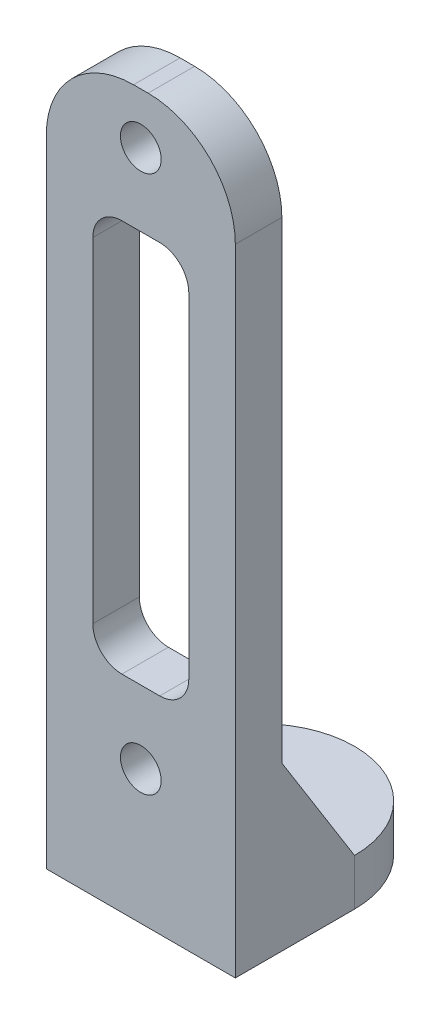
ISO-10303-21;
HEADER;
FILE_DESCRIPTION(('STEP AP214'),'2;1');
FILE_NAME('part.step','',(''),(''),'','','');
FILE_SCHEMA(('AUTOMOTIVE_DESIGN { 1 0 10303 214 1 1 1 1 }'));
ENDSEC;
DATA;
#1=APPLICATION_CONTEXT('core data for automotive mechanical design processes');
#2=APPLICATION_PROTOCOL_DEFINITION('international standard','automotive_design',2000,#1);
#3=PRODUCT_CONTEXT('',#1,'mechanical');
#4=PRODUCT('Part','Part','',(#3));
#5=PRODUCT_RELATED_PRODUCT_CATEGORY('part','',(#4));
#6=PRODUCT_DEFINITION_FORMATION('','',#4);
#7=PRODUCT_DEFINITION_CONTEXT('part definition',#1,'design');
#8=PRODUCT_DEFINITION('design','',#6,#7);
#9=PRODUCT_DEFINITION_SHAPE('','',#8);
#10=(LENGTH_UNIT() NAMED_UNIT(*) SI_UNIT(.MILLI.,.METRE.));
#11=(NAMED_UNIT(*) PLANE_ANGLE_UNIT() SI_UNIT($,.RADIAN.));
#12=(NAMED_UNIT(*) SI_UNIT($,.STERADIAN.) SOLID_ANGLE_UNIT());
#13=UNCERTAINTY_MEASURE_WITH_UNIT(LENGTH_MEASURE(1.E-05),#10,'distance_accuracy_value','');
#14=(GEOMETRIC_REPRESENTATION_CONTEXT(3) GLOBAL_UNCERTAINTY_ASSIGNED_CONTEXT((#13)) GLOBAL_UNIT_ASSIGNED_CONTEXT((#10,
#11,#12)) REPRESENTATION_CONTEXT('',''));
#15=CARTESIAN_POINT('',(0.,0.,0.));
#16=DIRECTION('',(0.,0.,1.));
#17=DIRECTION('',(1.,0.,0.));
#18=AXIS2_PLACEMENT_3D('',#15,#16,#17);
#19=CARTESIAN_POINT('',(6.,40.5,0.));
#20=DIRECTION('',(0.,0.,-1.));
#21=DIRECTION('',(-1.,0.,0.));
#22=AXIS2_PLACEMENT_3D('',#19,#20,#21);
#23=PLANE('',#22);
#24=CARTESIAN_POINT('',(6.5,6.,0.));
#25=DIRECTION('',(0.,0.,1.));
#26=DIRECTION('',(1.,0.,0.));
#27=AXIS2_PLACEMENT_3D('',#24,#25,#26);
#28=CIRCLE('',#27,1.4);
#29=CARTESIAN_POINT('',(7.9,6.,0.));
#30=VERTEX_POINT('',#29);
#31=EDGE_CURVE('E294',#30,#30,#28,.T.);
#32=ORIENTED_EDGE('',*,*,#31,.T.);
#33=EDGE_LOOP('',(#32));
#34=FACE_BOUND('',#33,.T.);
#35=CARTESIAN_POINT('',(6.5,43.,0.));
#36=DIRECTION('',(0.,0.,1.));
#37=DIRECTION('',(1.,0.,0.));
#38=AXIS2_PLACEMENT_3D('',#35,#36,#37);
#39=CIRCLE('',#38,1.4);
#40=CARTESIAN_POINT('',(7.9,43.,0.));
#41=VERTEX_POINT('',#40);
#42=EDGE_CURVE('E289',#41,#41,#39,.T.);
#43=ORIENTED_EDGE('',*,*,#42,.T.);
#44=EDGE_LOOP('',(#43));
#45=FACE_BOUND('',#44,.T.);
#46=DIRECTION('',(0.,1.,0.));
#47=VECTOR('',#46,1.);
#48=CARTESIAN_POINT('',(13.,0.,0.));
#49=LINE('',#48,#47);
#50=CARTESIAN_POINT('',(13.,8.,0.));
#51=VERTEX_POINT('',#50);
#52=CARTESIAN_POINT('',(13.,40.5,0.));
#53=VERTEX_POINT('',#52);
#54=EDGE_CURVE('E37',#51,#53,#49,.T.);
#55=ORIENTED_EDGE('',*,*,#54,.F.);
#56=DIRECTION('',(-1.,0.,0.));
#57=VECTOR('',#56,1.);
#58=CARTESIAN_POINT('',(13.,8.,0.));
#59=LINE('',#58,#57);
#60=CARTESIAN_POINT('',(11.,8.,0.));
#61=VERTEX_POINT('',#60);
#62=EDGE_CURVE('E236',#51,#61,#59,.T.);
#63=ORIENTED_EDGE('',*,*,#62,.T.);
#64=DIRECTION('',(0.,-1.,0.));
#65=VECTOR('',#64,1.);
#66=CARTESIAN_POINT('',(11.,8.,0.));
#67=LINE('',#66,#65);
#68=CARTESIAN_POINT('',(11.,0.,0.));
#69=VERTEX_POINT('',#68);
#70=EDGE_CURVE('E183',#61,#69,#67,.T.);
#71=ORIENTED_EDGE('',*,*,#70,.T.);
#72=DIRECTION('',(1.,0.,0.));
#73=VECTOR('',#72,1.);
#74=CARTESIAN_POINT('',(0.,0.,0.));
#75=LINE('',#74,#73);
#76=CARTESIAN_POINT('',(2.,0.,0.));
#77=VERTEX_POINT('',#76);
#78=EDGE_CURVE('E319',#77,#69,#75,.T.);
#79=ORIENTED_EDGE('',*,*,#78,.F.);
#80=DIRECTION('',(0.,-1.,0.));
#81=VECTOR('',#80,1.);
#82=CARTESIAN_POINT('',(2.,8.,0.));
#83=LINE('',#82,#81);
#84=CARTESIAN_POINT('',(2.,8.,0.));
#85=VERTEX_POINT('',#84);
#86=EDGE_CURVE('E248',#85,#77,#83,.T.);
#87=ORIENTED_EDGE('',*,*,#86,.F.);
#88=DIRECTION('',(-1.,0.,0.));
#89=VECTOR('',#88,1.);
#90=CARTESIAN_POINT('',(2.,8.,0.));
#91=LINE('',#90,#89);
#92=CARTESIAN_POINT('',(0.,8.,0.));
#93=VERTEX_POINT('',#92);
#94=EDGE_CURVE('E257',#85,#93,#91,.T.);
#95=ORIENTED_EDGE('',*,*,#94,.T.);
#96=DIRECTION('',(0.,-1.,0.));
#97=VECTOR('',#96,1.);
#98=CARTESIAN_POINT('',(0.,0.,0.));
#99=LINE('',#98,#97);
#100=CARTESIAN_POINT('',(0.,40.5,0.));
#101=VERTEX_POINT('',#100);
#102=EDGE_CURVE('E300',#101,#93,#99,.T.);
#103=ORIENTED_EDGE('',*,*,#102,.F.);
#104=CARTESIAN_POINT('',(6.,40.5,0.));
#105=DIRECTION('',(0.,0.,1.));
#106=DIRECTION('',(-1.,0.,0.));
#107=AXIS2_PLACEMENT_3D('',#104,#105,#106);
#108=CIRCLE('',#107,6.);
#109=CARTESIAN_POINT('',(6.,46.5,0.));
#110=VERTEX_POINT('',#109);
#111=EDGE_CURVE('E306',#110,#101,#108,.T.);
#112=ORIENTED_EDGE('',*,*,#111,.F.);
#113=DIRECTION('',(-1.,0.,0.));
#114=VECTOR('',#113,1.);
#115=CARTESIAN_POINT('',(6.,46.5,0.));
#116=LINE('',#115,#114);
#117=CARTESIAN_POINT('',(7.,46.5,0.));
#118=VERTEX_POINT('',#117);
#119=EDGE_CURVE('E334',#118,#110,#116,.T.);
#120=ORIENTED_EDGE('',*,*,#119,.F.);
#121=CARTESIAN_POINT('',(7.,40.5,0.));
#122=DIRECTION('',(0.,0.,1.));
#123=DIRECTION('',(-1.,0.,0.));
#124=AXIS2_PLACEMENT_3D('',#121,#122,#123);
#125=CIRCLE('',#124,6.);
#126=EDGE_CURVE('E317',#53,#118,#125,.T.);
#127=ORIENTED_EDGE('',*,*,#126,.F.);
#128=EDGE_LOOP('',(#55,#63,#71,#79,#87,#95,#103,#112,#120,#127));
#129=FACE_BOUND('',#128,.T.);
#130=DIRECTION('',(0.,-1.,0.));
#131=VECTOR('',#130,1.);
#132=CARTESIAN_POINT('',(3.2,36.,0.));
#133=LINE('',#132,#131);
#134=CARTESIAN_POINT('',(3.2,36.,0.));
#135=VERTEX_POINT('',#134);
#136=CARTESIAN_POINT('',(3.2,13.,0.));
#137=VERTEX_POINT('',#136);
#138=EDGE_CURVE('E176',#135,#137,#133,.T.);
#139=ORIENTED_EDGE('',*,*,#138,.T.);
#140=CARTESIAN_POINT('',(5.2,13.,0.));
#141=DIRECTION('',(0.,0.,1.));
#142=DIRECTION('',(1.,0.,0.));
#143=AXIS2_PLACEMENT_3D('',#140,#141,#142);
#144=CIRCLE('',#143,2.);
#145=CARTESIAN_POINT('',(5.2,11.,0.));
#146=VERTEX_POINT('',#145);
#147=EDGE_CURVE('E51',#137,#146,#144,.T.);
#148=ORIENTED_EDGE('',*,*,#147,.T.);
#149=DIRECTION('',(1.,0.,0.));
#150=VECTOR('',#149,1.);
#151=CARTESIAN_POINT('',(5.2,11.,0.));
#152=LINE('',#151,#150);
#153=CARTESIAN_POINT('',(7.8,11.,0.));
#154=VERTEX_POINT('',#153);
#155=EDGE_CURVE('E182',#146,#154,#152,.T.);
#156=ORIENTED_EDGE('',*,*,#155,.T.);
#157=CARTESIAN_POINT('',(7.8,13.,0.));
#158=DIRECTION('',(0.,0.,1.));
#159=DIRECTION('',(1.,0.,0.));
#160=AXIS2_PLACEMENT_3D('',#157,#158,#159);
#161=CIRCLE('',#160,2.);
#162=CARTESIAN_POINT('',(9.8,13.,0.));
#163=VERTEX_POINT('',#162);
#164=EDGE_CURVE('E205',#154,#163,#161,.T.);
#165=ORIENTED_EDGE('',*,*,#164,.T.);
#166=DIRECTION('',(0.,1.,0.));
#167=VECTOR('',#166,1.);
#168=CARTESIAN_POINT('',(9.8,36.,0.));
#169=LINE('',#168,#167);
#170=CARTESIAN_POINT('',(9.8,36.,0.));
#171=VERTEX_POINT('',#170);
#172=EDGE_CURVE('E208',#163,#171,#169,.T.);
#173=ORIENTED_EDGE('',*,*,#172,.T.);
#174=CARTESIAN_POINT('',(7.8,36.,0.));
#175=DIRECTION('',(0.,0.,1.));
#176=DIRECTION('',(-1.,0.,0.));
#177=AXIS2_PLACEMENT_3D('',#174,#175,#176);
#178=CIRCLE('',#177,2.);
#179=CARTESIAN_POINT('',(7.8,38.,0.));
#180=VERTEX_POINT('',#179);
#181=EDGE_CURVE('E211',#171,#180,#178,.T.);
#182=ORIENTED_EDGE('',*,*,#181,.T.);
#183=DIRECTION('',(-1.,0.,0.));
#184=VECTOR('',#183,1.);
#185=CARTESIAN_POINT('',(5.2,38.,0.));
#186=LINE('',#185,#184);
#187=CARTESIAN_POINT('',(5.2,38.,0.));
#188=VERTEX_POINT('',#187);
#189=EDGE_CURVE('E214',#180,#188,#186,.T.);
#190=ORIENTED_EDGE('',*,*,#189,.T.);
#191=CARTESIAN_POINT('',(5.2,36.,0.));
#192=DIRECTION('',(0.,0.,1.));
#193=DIRECTION('',(1.,0.,0.));
#194=AXIS2_PLACEMENT_3D('',#191,#192,#193);
#195=CIRCLE('',#194,2.);
#196=EDGE_CURVE('E217',#188,#135,#195,.T.);
#197=ORIENTED_EDGE('',*,*,#196,.T.);
#198=EDGE_LOOP('',(#139,#148,#156,#165,#173,#182,#190,#197));
#199=FACE_BOUND('',#198,.T.);
#200=ADVANCED_FACE('F33',(#34,#45,#129,#199),#23,.T.);
#201=CARTESIAN_POINT('',(6.,40.5,3.2));
#202=DIRECTION('',(0.,0.,-1.));
#203=DIRECTION('',(-1.,0.,0.));
#204=AXIS2_PLACEMENT_3D('',#201,#202,#203);
#205=PLANE('',#204);
#206=CARTESIAN_POINT('',(6.5,43.,3.2));
#207=DIRECTION('',(0.,0.,1.));
#208=DIRECTION('',(1.,0.,0.));
#209=AXIS2_PLACEMENT_3D('',#206,#207,#208);
#210=CIRCLE('',#209,1.4);
#211=CARTESIAN_POINT('',(7.9,43.,3.2));
#212=VERTEX_POINT('',#211);
#213=EDGE_CURVE('E291',#212,#212,#210,.T.);
#214=ORIENTED_EDGE('',*,*,#213,.F.);
#215=EDGE_LOOP('',(#214));
#216=FACE_BOUND('',#215,.T.);
#217=CARTESIAN_POINT('',(6.5,6.,3.2));
#218=DIRECTION('',(0.,0.,1.));
#219=DIRECTION('',(1.,0.,0.));
#220=AXIS2_PLACEMENT_3D('',#217,#218,#219);
#221=CIRCLE('',#220,1.4);
#222=CARTESIAN_POINT('',(7.9,6.,3.2));
#223=VERTEX_POINT('',#222);
#224=EDGE_CURVE('E297',#223,#223,#221,.T.);
#225=ORIENTED_EDGE('',*,*,#224,.F.);
#226=EDGE_LOOP('',(#225));
#227=FACE_BOUND('',#226,.T.);
#228=DIRECTION('',(0.,-1.,0.));
#229=VECTOR('',#228,1.);
#230=CARTESIAN_POINT('',(0.,0.,3.2));
#231=LINE('',#230,#229);
#232=CARTESIAN_POINT('',(0.,40.5,3.2));
#233=VERTEX_POINT('',#232);
#234=CARTESIAN_POINT('',(0.,-3.2,3.2));
#235=VERTEX_POINT('',#234);
#236=EDGE_CURVE('E303',#233,#235,#231,.T.);
#237=ORIENTED_EDGE('',*,*,#236,.T.);
#238=DIRECTION('',(1.,0.,0.));
#239=VECTOR('',#238,1.);
#240=CARTESIAN_POINT('',(0.,-3.2,3.2));
#241=LINE('',#240,#239);
#242=CARTESIAN_POINT('',(13.,-3.2,3.2));
#243=VERTEX_POINT('',#242);
#244=EDGE_CURVE('E277',#235,#243,#241,.T.);
#245=ORIENTED_EDGE('',*,*,#244,.T.);
#246=DIRECTION('',(0.,1.,0.));
#247=VECTOR('',#246,1.);
#248=CARTESIAN_POINT('',(13.,0.,3.2));
#249=LINE('',#248,#247);
#250=CARTESIAN_POINT('',(13.,40.5,3.2));
#251=VERTEX_POINT('',#250);
#252=EDGE_CURVE('E305',#243,#251,#249,.T.);
#253=ORIENTED_EDGE('',*,*,#252,.T.);
#254=CARTESIAN_POINT('',(7.,40.5,3.2));
#255=DIRECTION('',(0.,0.,1.));
#256=DIRECTION('',(-1.,0.,0.));
#257=AXIS2_PLACEMENT_3D('',#254,#255,#256);
#258=CIRCLE('',#257,6.);
#259=CARTESIAN_POINT('',(7.,46.5,3.2));
#260=VERTEX_POINT('',#259);
#261=EDGE_CURVE('E308',#251,#260,#258,.T.);
#262=ORIENTED_EDGE('',*,*,#261,.T.);
#263=DIRECTION('',(-1.,0.,0.));
#264=VECTOR('',#263,1.);
#265=CARTESIAN_POINT('',(6.,46.5,3.2));
#266=LINE('',#265,#264);
#267=CARTESIAN_POINT('',(6.,46.5,3.2));
#268=VERTEX_POINT('',#267);
#269=EDGE_CURVE('E310',#260,#268,#266,.T.);
#270=ORIENTED_EDGE('',*,*,#269,.T.);
#271=CARTESIAN_POINT('',(6.,40.5,3.2));
#272=DIRECTION('',(0.,0.,1.));
#273=DIRECTION('',(-1.,0.,0.));
#274=AXIS2_PLACEMENT_3D('',#271,#272,#273);
#275=CIRCLE('',#274,6.);
#276=EDGE_CURVE('E312',#268,#233,#275,.T.);
#277=ORIENTED_EDGE('',*,*,#276,.T.);
#278=EDGE_LOOP('',(#237,#245,#253,#262,#270,#277));
#279=FACE_BOUND('',#278,.T.);
#280=CARTESIAN_POINT('',(5.2,13.,3.2));
#281=DIRECTION('',(0.,0.,1.));
#282=DIRECTION('',(1.,0.,0.));
#283=AXIS2_PLACEMENT_3D('',#280,#281,#282);
#284=CIRCLE('',#283,2.);
#285=CARTESIAN_POINT('',(3.2,13.,3.2));
#286=VERTEX_POINT('',#285);
#287=CARTESIAN_POINT('',(5.2,11.,3.2));
#288=VERTEX_POINT('',#287);
#289=EDGE_CURVE('E167',#286,#288,#284,.T.);
#290=ORIENTED_EDGE('',*,*,#289,.F.);
#291=DIRECTION('',(0.,-1.,0.));
#292=VECTOR('',#291,1.);
#293=CARTESIAN_POINT('',(3.2,36.,3.2));
#294=LINE('',#293,#292);
#295=CARTESIAN_POINT('',(3.2,36.,3.2));
#296=VERTEX_POINT('',#295);
#297=EDGE_CURVE('E201',#296,#286,#294,.T.);
#298=ORIENTED_EDGE('',*,*,#297,.F.);
#299=CARTESIAN_POINT('',(5.2,36.,3.2));
#300=DIRECTION('',(0.,0.,1.));
#301=DIRECTION('',(1.,0.,0.));
#302=AXIS2_PLACEMENT_3D('',#299,#300,#301);
#303=CIRCLE('',#302,2.);
#304=CARTESIAN_POINT('',(5.2,38.,3.2));
#305=VERTEX_POINT('',#304);
#306=EDGE_CURVE('E199',#305,#296,#303,.T.);
#307=ORIENTED_EDGE('',*,*,#306,.F.);
#308=DIRECTION('',(-1.,0.,0.));
#309=VECTOR('',#308,1.);
#310=CARTESIAN_POINT('',(5.2,38.,3.2));
#311=LINE('',#310,#309);
#312=CARTESIAN_POINT('',(7.8,38.,3.2));
#313=VERTEX_POINT('',#312);
#314=EDGE_CURVE('E197',#313,#305,#311,.T.);
#315=ORIENTED_EDGE('',*,*,#314,.F.);
#316=CARTESIAN_POINT('',(7.8,36.,3.2));
#317=DIRECTION('',(0.,0.,1.));
#318=DIRECTION('',(-1.,0.,0.));
#319=AXIS2_PLACEMENT_3D('',#316,#317,#318);
#320=CIRCLE('',#319,2.);
#321=CARTESIAN_POINT('',(9.8,36.,3.2));
#322=VERTEX_POINT('',#321);
#323=EDGE_CURVE('E195',#322,#313,#320,.T.);
#324=ORIENTED_EDGE('',*,*,#323,.F.);
#325=DIRECTION('',(0.,1.,0.));
#326=VECTOR('',#325,1.);
#327=CARTESIAN_POINT('',(9.8,36.,3.2));
#328=LINE('',#327,#326);
#329=CARTESIAN_POINT('',(9.8,13.,3.2));
#330=VERTEX_POINT('',#329);
#331=EDGE_CURVE('E191',#330,#322,#328,.T.);
#332=ORIENTED_EDGE('',*,*,#331,.F.);
#333=CARTESIAN_POINT('',(7.8,13.,3.2));
#334=DIRECTION('',(0.,0.,1.));
#335=DIRECTION('',(1.,0.,0.));
#336=AXIS2_PLACEMENT_3D('',#333,#334,#335);
#337=CIRCLE('',#336,2.);
#338=CARTESIAN_POINT('',(7.8,11.,3.2));
#339=VERTEX_POINT('',#338);
#340=EDGE_CURVE('E189',#339,#330,#337,.T.);
#341=ORIENTED_EDGE('',*,*,#340,.F.);
#342=DIRECTION('',(1.,0.,0.));
#343=VECTOR('',#342,1.);
#344=CARTESIAN_POINT('',(5.2,11.,3.2));
#345=LINE('',#344,#343);
#346=EDGE_CURVE('E175',#288,#339,#345,.T.);
#347=ORIENTED_EDGE('',*,*,#346,.F.);
#348=EDGE_LOOP('',(#290,#298,#307,#315,#324,#332,#341,#347));
#349=FACE_BOUND('',#348,.T.);
#350=ADVANCED_FACE('F187',(#216,#227,#279,#349),#205,.F.);
#351=CARTESIAN_POINT('',(6.5,0.,-5.));
#352=DIRECTION('',(0.,1.,0.));
#353=DIRECTION('',(0.,0.,1.));
#354=AXIS2_PLACEMENT_3D('',#351,#352,#353);
#355=PLANE('',#354);
#356=CARTESIAN_POINT('',(6.5,0.,-5.));
#357=DIRECTION('',(0.,1.,0.));
#358=DIRECTION('',(0.,0.,1.));
#359=AXIS2_PLACEMENT_3D('',#356,#357,#358);
#360=CIRCLE('',#359,1.65);
#361=CARTESIAN_POINT('',(6.5,0.,-3.35));
#362=VERTEX_POINT('',#361);
#363=EDGE_CURVE('E264',#362,#362,#360,.T.);
#364=ORIENTED_EDGE('',*,*,#363,.F.);
#365=EDGE_LOOP('',(#364));
#366=FACE_BOUND('',#365,.T.);
#367=DIRECTION('',(0.,0.,-1.));
#368=VECTOR('',#367,1.);
#369=CARTESIAN_POINT('',(11.,0.,0.));
#370=LINE('',#369,#368);
#371=CARTESIAN_POINT('',(11.,0.,-5.));
#372=VERTEX_POINT('',#371);
#373=EDGE_CURVE('E239',#69,#372,#370,.T.);
#374=ORIENTED_EDGE('',*,*,#373,.T.);
#375=DIRECTION('',(-1.,0.,0.));
#376=VECTOR('',#375,1.);
#377=CARTESIAN_POINT('',(13.,0.,-5.));
#378=LINE('',#377,#376);
#379=CARTESIAN_POINT('',(13.,0.,-5.));
#380=VERTEX_POINT('',#379);
#381=EDGE_CURVE('E244',#380,#372,#378,.T.);
#382=ORIENTED_EDGE('',*,*,#381,.F.);
#383=CARTESIAN_POINT('',(6.5,0.,-5.));
#384=DIRECTION('',(0.,1.,0.));
#385=DIRECTION('',(0.,0.,1.));
#386=AXIS2_PLACEMENT_3D('',#383,#384,#385);
#387=CIRCLE('',#386,6.5);
#388=CARTESIAN_POINT('',(0.,0.,-5.));
#389=VERTEX_POINT('',#388);
#390=EDGE_CURVE('E268',#380,#389,#387,.T.);
#391=ORIENTED_EDGE('',*,*,#390,.T.);
#392=DIRECTION('',(-1.,0.,0.));
#393=VECTOR('',#392,1.);
#394=CARTESIAN_POINT('',(2.,0.,-5.));
#395=LINE('',#394,#393);
#396=CARTESIAN_POINT('',(2.,0.,-5.));
#397=VERTEX_POINT('',#396);
#398=EDGE_CURVE('E261',#397,#389,#395,.T.);
#399=ORIENTED_EDGE('',*,*,#398,.F.);
#400=DIRECTION('',(0.,0.,-1.));
#401=VECTOR('',#400,1.);
#402=CARTESIAN_POINT('',(2.,0.,0.));
#403=LINE('',#402,#401);
#404=EDGE_CURVE('E251',#77,#397,#403,.T.);
#405=ORIENTED_EDGE('',*,*,#404,.F.);
#406=ORIENTED_EDGE('',*,*,#78,.T.);
#407=EDGE_LOOP('',(#374,#382,#391,#399,#405,#406));
#408=FACE_BOUND('',#407,.T.);
#409=ADVANCED_FACE('F384',(#366,#408),#355,.T.);
#410=CARTESIAN_POINT('',(0.,0.,3.2));
#411=DIRECTION('',(1.,0.,0.));
#412=DIRECTION('',(0.,0.,-1.));
#413=AXIS2_PLACEMENT_3D('',#410,#411,#412);
#414=PLANE('',#413);
#415=ORIENTED_EDGE('',*,*,#102,.T.);
#416=DIRECTION('',(0.,0.847998304005088,0.52999894000318));
#417=VECTOR('',#416,1.);
#418=CARTESIAN_POINT('',(0.,0.,-5.));
#419=LINE('',#418,#417);
#420=EDGE_CURVE('E247',#389,#93,#419,.T.);
#421=ORIENTED_EDGE('',*,*,#420,.F.);
#422=DIRECTION('',(0.,1.,0.));
#423=VECTOR('',#422,1.);
#424=CARTESIAN_POINT('',(0.,-3.2,-5.));
#425=LINE('',#424,#423);
#426=CARTESIAN_POINT('',(0.,-3.2,-5.));
#427=VERTEX_POINT('',#426);
#428=EDGE_CURVE('E283',#427,#389,#425,.T.);
#429=ORIENTED_EDGE('',*,*,#428,.F.);
#430=DIRECTION('',(0.,0.,1.));
#431=VECTOR('',#430,1.);
#432=CARTESIAN_POINT('',(0.,-3.2,-5.));
#433=LINE('',#432,#431);
#434=EDGE_CURVE('E274',#427,#235,#433,.T.);
#435=ORIENTED_EDGE('',*,*,#434,.T.);
#436=ORIENTED_EDGE('',*,*,#236,.F.);
#437=DIRECTION('',(0.,0.,-1.));
#438=VECTOR('',#437,1.);
#439=CARTESIAN_POINT('',(0.,40.5,3.2));
#440=LINE('',#439,#438);
#441=EDGE_CURVE('E314',#233,#101,#440,.T.);
#442=ORIENTED_EDGE('',*,*,#441,.T.);
#443=EDGE_LOOP('',(#415,#421,#429,#435,#436,#442));
#444=FACE_BOUND('',#443,.T.);
#445=ADVANCED_FACE('F35',(#444),#414,.F.);
#446=CARTESIAN_POINT('',(13.,0.,3.2));
#447=DIRECTION('',(-1.,0.,0.));
#448=DIRECTION('',(0.,0.,1.));
#449=AXIS2_PLACEMENT_3D('',#446,#447,#448);
#450=PLANE('',#449);
#451=DIRECTION('',(0.,0.847998304005088,0.52999894000318));
#452=VECTOR('',#451,1.);
#453=CARTESIAN_POINT('',(13.,0.,-5.));
#454=LINE('',#453,#452);
#455=EDGE_CURVE('E233',#380,#51,#454,.T.);
#456=ORIENTED_EDGE('',*,*,#455,.T.);
#457=ORIENTED_EDGE('',*,*,#54,.T.);
#458=DIRECTION('',(0.,0.,-1.));
#459=VECTOR('',#458,1.);
#460=CARTESIAN_POINT('',(13.,40.5,3.2));
#461=LINE('',#460,#459);
#462=EDGE_CURVE('E11',#251,#53,#461,.T.);
#463=ORIENTED_EDGE('',*,*,#462,.F.);
#464=ORIENTED_EDGE('',*,*,#252,.F.);
#465=DIRECTION('',(0.,0.,-1.));
#466=VECTOR('',#465,1.);
#467=CARTESIAN_POINT('',(13.,-3.2,3.2));
#468=LINE('',#467,#466);
#469=CARTESIAN_POINT('',(13.,-3.2,-5.));
#470=VERTEX_POINT('',#469);
#471=EDGE_CURVE('E280',#243,#470,#468,.T.);
#472=ORIENTED_EDGE('',*,*,#471,.T.);
#473=DIRECTION('',(0.,1.,0.));
#474=VECTOR('',#473,1.);
#475=CARTESIAN_POINT('',(13.,-3.2,-5.));
#476=LINE('',#475,#474);
#477=EDGE_CURVE('E286',#470,#380,#476,.T.);
#478=ORIENTED_EDGE('',*,*,#477,.T.);
#479=EDGE_LOOP('',(#456,#457,#463,#464,#472,#478));
#480=FACE_BOUND('',#479,.T.);
#481=ADVANCED_FACE('F343',(#480),#450,.F.);
#482=CARTESIAN_POINT('',(7.,40.5,3.2));
#483=DIRECTION('',(0.,0.,-1.));
#484=DIRECTION('',(-1.,0.,0.));
#485=AXIS2_PLACEMENT_3D('',#482,#483,#484);
#486=CYLINDRICAL_SURFACE('',#485,6.);
#487=ORIENTED_EDGE('',*,*,#126,.T.);
#488=DIRECTION('',(0.,0.,-1.));
#489=VECTOR('',#488,1.);
#490=CARTESIAN_POINT('',(7.,46.5,3.2));
#491=LINE('',#490,#489);
#492=EDGE_CURVE('E43',#260,#118,#491,.T.);
#493=ORIENTED_EDGE('',*,*,#492,.F.);
#494=ORIENTED_EDGE('',*,*,#261,.F.);
#495=ORIENTED_EDGE('',*,*,#462,.T.);
#496=EDGE_LOOP('',(#487,#493,#494,#495));
#497=FACE_BOUND('',#496,.T.);
#498=ADVANCED_FACE('F348',(#497),#486,.T.);
#499=CARTESIAN_POINT('',(6.,46.5,3.2));
#500=DIRECTION('',(0.,-1.,0.));
#501=DIRECTION('',(0.,0.,-1.));
#502=AXIS2_PLACEMENT_3D('',#499,#500,#501);
#503=PLANE('',#502);
#504=ORIENTED_EDGE('',*,*,#119,.T.);
#505=DIRECTION('',(0.,0.,-1.));
#506=VECTOR('',#505,1.);
#507=CARTESIAN_POINT('',(6.,46.5,3.2));
#508=LINE('',#507,#506);
#509=EDGE_CURVE('E329',#268,#110,#508,.T.);
#510=ORIENTED_EDGE('',*,*,#509,.F.);
#511=ORIENTED_EDGE('',*,*,#269,.F.);
#512=ORIENTED_EDGE('',*,*,#492,.T.);
#513=EDGE_LOOP('',(#504,#510,#511,#512));
#514=FACE_BOUND('',#513,.T.);
#515=ADVANCED_FACE('F368',(#514),#503,.F.);
#516=CARTESIAN_POINT('',(6.,40.5,3.2));
#517=DIRECTION('',(0.,0.,-1.));
#518=DIRECTION('',(-1.,0.,0.));
#519=AXIS2_PLACEMENT_3D('',#516,#517,#518);
#520=CYLINDRICAL_SURFACE('',#519,6.);
#521=ORIENTED_EDGE('',*,*,#111,.T.);
#522=ORIENTED_EDGE('',*,*,#441,.F.);
#523=ORIENTED_EDGE('',*,*,#276,.F.);
#524=ORIENTED_EDGE('',*,*,#509,.T.);
#525=EDGE_LOOP('',(#521,#522,#523,#524));
#526=FACE_BOUND('',#525,.T.);
#527=ADVANCED_FACE('F354',(#526),#520,.T.);
#528=CARTESIAN_POINT('',(6.5,6.,3.2));
#529=DIRECTION('',(0.,0.,-1.));
#530=DIRECTION('',(-1.,0.,0.));
#531=AXIS2_PLACEMENT_3D('',#528,#529,#530);
#532=CYLINDRICAL_SURFACE('',#531,1.4);
#533=ORIENTED_EDGE('',*,*,#224,.T.);
#534=EDGE_LOOP('',(#533));
#535=FACE_BOUND('',#534,.T.);
#536=ORIENTED_EDGE('',*,*,#31,.F.);
#537=EDGE_LOOP('',(#536));
#538=FACE_BOUND('',#537,.T.);
#539=ADVANCED_FACE('F375',(#535,#538),#532,.F.);
#540=CARTESIAN_POINT('',(6.5,43.,3.2));
#541=DIRECTION('',(0.,0.,-1.));
#542=DIRECTION('',(-1.,0.,0.));
#543=AXIS2_PLACEMENT_3D('',#540,#541,#542);
#544=CYLINDRICAL_SURFACE('',#543,1.4);
#545=ORIENTED_EDGE('',*,*,#213,.T.);
#546=EDGE_LOOP('',(#545));
#547=FACE_BOUND('',#546,.T.);
#548=ORIENTED_EDGE('',*,*,#42,.F.);
#549=EDGE_LOOP('',(#548));
#550=FACE_BOUND('',#549,.T.);
#551=ADVANCED_FACE('F391',(#547,#550),#544,.F.);
#552=CARTESIAN_POINT('',(6.5,-3.2,-5.));
#553=DIRECTION('',(0.,1.,0.));
#554=DIRECTION('',(0.,0.,1.));
#555=AXIS2_PLACEMENT_3D('',#552,#553,#554);
#556=CYLINDRICAL_SURFACE('',#555,6.5);
#557=ORIENTED_EDGE('',*,*,#390,.F.);
#558=ORIENTED_EDGE('',*,*,#477,.F.);
#559=CARTESIAN_POINT('',(6.5,-3.2,-5.));
#560=DIRECTION('',(0.,1.,0.));
#561=DIRECTION('',(0.,0.,1.));
#562=AXIS2_PLACEMENT_3D('',#559,#560,#561);
#563=CIRCLE('',#562,6.5);
#564=EDGE_CURVE('E271',#470,#427,#563,.T.);
#565=ORIENTED_EDGE('',*,*,#564,.T.);
#566=ORIENTED_EDGE('',*,*,#428,.T.);
#567=EDGE_LOOP('',(#557,#558,#565,#566));
#568=FACE_BOUND('',#567,.T.);
#569=ADVANCED_FACE('F395',(#568),#556,.T.);
#570=CARTESIAN_POINT('',(6.5,-3.2,-5.));
#571=DIRECTION('',(0.,1.,0.));
#572=DIRECTION('',(0.,0.,1.));
#573=AXIS2_PLACEMENT_3D('',#570,#571,#572);
#574=PLANE('',#573);
#575=CARTESIAN_POINT('',(6.5,-3.2,-5.));
#576=DIRECTION('',(0.,1.,0.));
#577=DIRECTION('',(0.,0.,1.));
#578=AXIS2_PLACEMENT_3D('',#575,#576,#577);
#579=CIRCLE('',#578,1.65);
#580=CARTESIAN_POINT('',(6.5,-3.2,-3.35));
#581=VERTEX_POINT('',#580);
#582=EDGE_CURVE('E265',#581,#581,#579,.T.);
#583=ORIENTED_EDGE('',*,*,#582,.T.);
#584=EDGE_LOOP('',(#583));
#585=FACE_BOUND('',#584,.T.);
#586=ORIENTED_EDGE('',*,*,#564,.F.);
#587=ORIENTED_EDGE('',*,*,#471,.F.);
#588=ORIENTED_EDGE('',*,*,#244,.F.);
#589=ORIENTED_EDGE('',*,*,#434,.F.);
#590=EDGE_LOOP('',(#586,#587,#588,#589));
#591=FACE_BOUND('',#590,.T.);
#592=ADVANCED_FACE('F365',(#585,#591),#574,.F.);
#593=CARTESIAN_POINT('',(6.5,-3.2,-5.));
#594=DIRECTION('',(0.,1.,0.));
#595=DIRECTION('',(0.,0.,1.));
#596=AXIS2_PLACEMENT_3D('',#593,#594,#595);
#597=CYLINDRICAL_SURFACE('',#596,1.65);
#598=ORIENTED_EDGE('',*,*,#582,.F.);
#599=EDGE_LOOP('',(#598));
#600=FACE_BOUND('',#599,.T.);
#601=ORIENTED_EDGE('',*,*,#363,.T.);
#602=EDGE_LOOP('',(#601));
#603=FACE_BOUND('',#602,.T.);
#604=ADVANCED_FACE('F405',(#600,#603),#597,.F.);
#605=CARTESIAN_POINT('',(2.,0.,-5.));
#606=DIRECTION('',(0.,-0.52999894000318,0.847998304005088));
#607=DIRECTION('',(0.,-0.847998304005088,-0.52999894000318));
#608=AXIS2_PLACEMENT_3D('',#605,#606,#607);
#609=PLANE('',#608);
#610=ORIENTED_EDGE('',*,*,#420,.T.);
#611=ORIENTED_EDGE('',*,*,#94,.F.);
#612=DIRECTION('',(0.,0.847998304005088,0.52999894000318));
#613=VECTOR('',#612,1.);
#614=CARTESIAN_POINT('',(2.,0.,-5.));
#615=LINE('',#614,#613);
#616=EDGE_CURVE('E254',#397,#85,#615,.T.);
#617=ORIENTED_EDGE('',*,*,#616,.F.);
#618=ORIENTED_EDGE('',*,*,#398,.T.);
#619=EDGE_LOOP('',(#610,#611,#617,#618));
#620=FACE_BOUND('',#619,.T.);
#621=ADVANCED_FACE('F409',(#620),#609,.F.);
#622=CARTESIAN_POINT('',(2.,0.,0.));
#623=DIRECTION('',(1.,0.,0.));
#624=DIRECTION('',(0.,0.,-1.));
#625=AXIS2_PLACEMENT_3D('',#622,#623,#624);
#626=PLANE('',#625);
#627=ORIENTED_EDGE('',*,*,#86,.T.);
#628=ORIENTED_EDGE('',*,*,#404,.T.);
#629=ORIENTED_EDGE('',*,*,#616,.T.);
#630=EDGE_LOOP('',(#627,#628,#629));
#631=FACE_BOUND('',#630,.T.);
#632=ADVANCED_FACE('F413',(#631),#626,.T.);
#633=CARTESIAN_POINT('',(13.,0.,-5.));
#634=DIRECTION('',(0.,-0.52999894000318,0.847998304005088));
#635=DIRECTION('',(0.,-0.847998304005088,-0.52999894000318));
#636=AXIS2_PLACEMENT_3D('',#633,#634,#635);
#637=PLANE('',#636);
#638=DIRECTION('',(0.,0.847998304005088,0.52999894000318));
#639=VECTOR('',#638,1.);
#640=CARTESIAN_POINT('',(11.,0.,-5.));
#641=LINE('',#640,#639);
#642=EDGE_CURVE('E237',#372,#61,#641,.T.);
#643=ORIENTED_EDGE('',*,*,#642,.T.);
#644=ORIENTED_EDGE('',*,*,#62,.F.);
#645=ORIENTED_EDGE('',*,*,#455,.F.);
#646=ORIENTED_EDGE('',*,*,#381,.T.);
#647=EDGE_LOOP('',(#643,#644,#645,#646));
#648=FACE_BOUND('',#647,.T.);
#649=ADVANCED_FACE('F417',(#648),#637,.F.);
#650=CARTESIAN_POINT('',(11.,0.,0.));
#651=DIRECTION('',(1.,0.,0.));
#652=DIRECTION('',(0.,0.,-1.));
#653=AXIS2_PLACEMENT_3D('',#650,#651,#652);
#654=PLANE('',#653);
#655=ORIENTED_EDGE('',*,*,#70,.F.);
#656=ORIENTED_EDGE('',*,*,#642,.F.);
#657=ORIENTED_EDGE('',*,*,#373,.F.);
#658=EDGE_LOOP('',(#655,#656,#657));
#659=FACE_BOUND('',#658,.T.);
#660=ADVANCED_FACE('F421',(#659),#654,.F.);
#661=CARTESIAN_POINT('',(5.2,13.,3.2));
#662=DIRECTION('',(0.,0.,-1.));
#663=DIRECTION('',(-1.,0.,0.));
#664=AXIS2_PLACEMENT_3D('',#661,#662,#663);
#665=CYLINDRICAL_SURFACE('',#664,2.);
#666=ORIENTED_EDGE('',*,*,#147,.F.);
#667=DIRECTION('',(0.,0.,-1.));
#668=VECTOR('',#667,1.);
#669=CARTESIAN_POINT('',(3.2,13.,3.2));
#670=LINE('',#669,#668);
#671=EDGE_CURVE('E171',#286,#137,#670,.T.);
#672=ORIENTED_EDGE('',*,*,#671,.F.);
#673=ORIENTED_EDGE('',*,*,#289,.T.);
#674=DIRECTION('',(0.,0.,-1.));
#675=VECTOR('',#674,1.);
#676=CARTESIAN_POINT('',(5.2,11.,3.2));
#677=LINE('',#676,#675);
#678=EDGE_CURVE('E170',#288,#146,#677,.T.);
#679=ORIENTED_EDGE('',*,*,#678,.T.);
#680=EDGE_LOOP('',(#666,#672,#673,#679));
#681=FACE_BOUND('',#680,.T.);
#682=ADVANCED_FACE('F169',(#681),#665,.F.);
#683=CARTESIAN_POINT('',(5.2,11.,3.2));
#684=DIRECTION('',(0.,1.,0.));
#685=DIRECTION('',(0.,0.,1.));
#686=AXIS2_PLACEMENT_3D('',#683,#684,#685);
#687=PLANE('',#686);
#688=ORIENTED_EDGE('',*,*,#155,.F.);
#689=ORIENTED_EDGE('',*,*,#678,.F.);
#690=ORIENTED_EDGE('',*,*,#346,.T.);
#691=DIRECTION('',(0.,0.,-1.));
#692=VECTOR('',#691,1.);
#693=CARTESIAN_POINT('',(7.8,11.,3.2));
#694=LINE('',#693,#692);
#695=EDGE_CURVE('E184',#339,#154,#694,.T.);
#696=ORIENTED_EDGE('',*,*,#695,.T.);
#697=EDGE_LOOP('',(#688,#689,#690,#696));
#698=FACE_BOUND('',#697,.T.);
#699=ADVANCED_FACE('F179',(#698),#687,.T.);
#700=CARTESIAN_POINT('',(7.8,13.,3.2));
#701=DIRECTION('',(0.,0.,-1.));
#702=DIRECTION('',(-1.,0.,0.));
#703=AXIS2_PLACEMENT_3D('',#700,#701,#702);
#704=CYLINDRICAL_SURFACE('',#703,2.);
#705=ORIENTED_EDGE('',*,*,#164,.F.);
#706=ORIENTED_EDGE('',*,*,#695,.F.);
#707=ORIENTED_EDGE('',*,*,#340,.T.);
#708=DIRECTION('',(0.,0.,-1.));
#709=VECTOR('',#708,1.);
#710=CARTESIAN_POINT('',(9.8,13.,3.2));
#711=LINE('',#710,#709);
#712=EDGE_CURVE('E230',#330,#163,#711,.T.);
#713=ORIENTED_EDGE('',*,*,#712,.T.);
#714=EDGE_LOOP('',(#705,#706,#707,#713));
#715=FACE_BOUND('',#714,.T.);
#716=ADVANCED_FACE('F430',(#715),#704,.F.);
#717=CARTESIAN_POINT('',(9.8,36.,3.2));
#718=DIRECTION('',(-1.,0.,0.));
#719=DIRECTION('',(0.,-1.,0.));
#720=AXIS2_PLACEMENT_3D('',#717,#718,#719);
#721=PLANE('',#720);
#722=ORIENTED_EDGE('',*,*,#172,.F.);
#723=ORIENTED_EDGE('',*,*,#712,.F.);
#724=ORIENTED_EDGE('',*,*,#331,.T.);
#725=DIRECTION('',(0.,0.,-1.));
#726=VECTOR('',#725,1.);
#727=CARTESIAN_POINT('',(9.8,36.,3.2));
#728=LINE('',#727,#726);
#729=EDGE_CURVE('E228',#322,#171,#728,.T.);
#730=ORIENTED_EDGE('',*,*,#729,.T.);
#731=EDGE_LOOP('',(#722,#723,#724,#730));
#732=FACE_BOUND('',#731,.T.);
#733=ADVANCED_FACE('F433',(#732),#721,.T.);
#734=CARTESIAN_POINT('',(7.8,36.,3.2));
#735=DIRECTION('',(0.,0.,-1.));
#736=DIRECTION('',(-1.,0.,0.));
#737=AXIS2_PLACEMENT_3D('',#734,#735,#736);
#738=CYLINDRICAL_SURFACE('',#737,2.);
#739=ORIENTED_EDGE('',*,*,#181,.F.);
#740=ORIENTED_EDGE('',*,*,#729,.F.);
#741=ORIENTED_EDGE('',*,*,#323,.T.);
#742=DIRECTION('',(0.,0.,-1.));
#743=VECTOR('',#742,1.);
#744=CARTESIAN_POINT('',(7.8,38.,3.2));
#745=LINE('',#744,#743);
#746=EDGE_CURVE('E226',#313,#180,#745,.T.);
#747=ORIENTED_EDGE('',*,*,#746,.T.);
#748=EDGE_LOOP('',(#739,#740,#741,#747));
#749=FACE_BOUND('',#748,.T.);
#750=ADVANCED_FACE('F437',(#749),#738,.F.);
#751=CARTESIAN_POINT('',(5.2,38.,3.2));
#752=DIRECTION('',(0.,-1.,0.));
#753=DIRECTION('',(0.,0.,-1.));
#754=AXIS2_PLACEMENT_3D('',#751,#752,#753);
#755=PLANE('',#754);
#756=ORIENTED_EDGE('',*,*,#189,.F.);
#757=ORIENTED_EDGE('',*,*,#746,.F.);
#758=ORIENTED_EDGE('',*,*,#314,.T.);
#759=DIRECTION('',(0.,0.,-1.));
#760=VECTOR('',#759,1.);
#761=CARTESIAN_POINT('',(5.2,38.,3.2));
#762=LINE('',#761,#760);
#763=EDGE_CURVE('E224',#305,#188,#762,.T.);
#764=ORIENTED_EDGE('',*,*,#763,.T.);
#765=EDGE_LOOP('',(#756,#757,#758,#764));
#766=FACE_BOUND('',#765,.T.);
#767=ADVANCED_FACE('F441',(#766),#755,.T.);
#768=CARTESIAN_POINT('',(5.2,36.,3.2));
#769=DIRECTION('',(0.,0.,-1.));
#770=DIRECTION('',(-1.,0.,0.));
#771=AXIS2_PLACEMENT_3D('',#768,#769,#770);
#772=CYLINDRICAL_SURFACE('',#771,2.);
#773=ORIENTED_EDGE('',*,*,#196,.F.);
#774=ORIENTED_EDGE('',*,*,#763,.F.);
#775=ORIENTED_EDGE('',*,*,#306,.T.);
#776=DIRECTION('',(0.,0.,-1.));
#777=VECTOR('',#776,1.);
#778=CARTESIAN_POINT('',(3.2,36.,3.2));
#779=LINE('',#778,#777);
#780=EDGE_CURVE('E59',#296,#135,#779,.T.);
#781=ORIENTED_EDGE('',*,*,#780,.T.);
#782=EDGE_LOOP('',(#773,#774,#775,#781));
#783=FACE_BOUND('',#782,.T.);
#784=ADVANCED_FACE('F445',(#783),#772,.F.);
#785=CARTESIAN_POINT('',(3.2,36.,3.2));
#786=DIRECTION('',(1.,0.,0.));
#787=DIRECTION('',(0.,1.,0.));
#788=AXIS2_PLACEMENT_3D('',#785,#786,#787);
#789=PLANE('',#788);
#790=ORIENTED_EDGE('',*,*,#138,.F.);
#791=ORIENTED_EDGE('',*,*,#780,.F.);
#792=ORIENTED_EDGE('',*,*,#297,.T.);
#793=ORIENTED_EDGE('',*,*,#671,.T.);
#794=EDGE_LOOP('',(#790,#791,#792,#793));
#795=FACE_BOUND('',#794,.T.);
#796=ADVANCED_FACE('F449',(#795),#789,.T.);
#797=CLOSED_SHELL('',(#200,#350,#409,#445,#481,#498,#515,#527,#539,#551,#569,#592,#604,#621,
#632,#649,#660,#682,#699,#716,#733,#750,#767,#784,#796));
#798=MANIFOLD_SOLID_BREP('B2',#797);
#799=ADVANCED_BREP_SHAPE_REPRESENTATION('',(#18,#798),#14);
#800=SHAPE_DEFINITION_REPRESENTATION(#9,#799);
ENDSEC;
END-ISO-10303-21;
